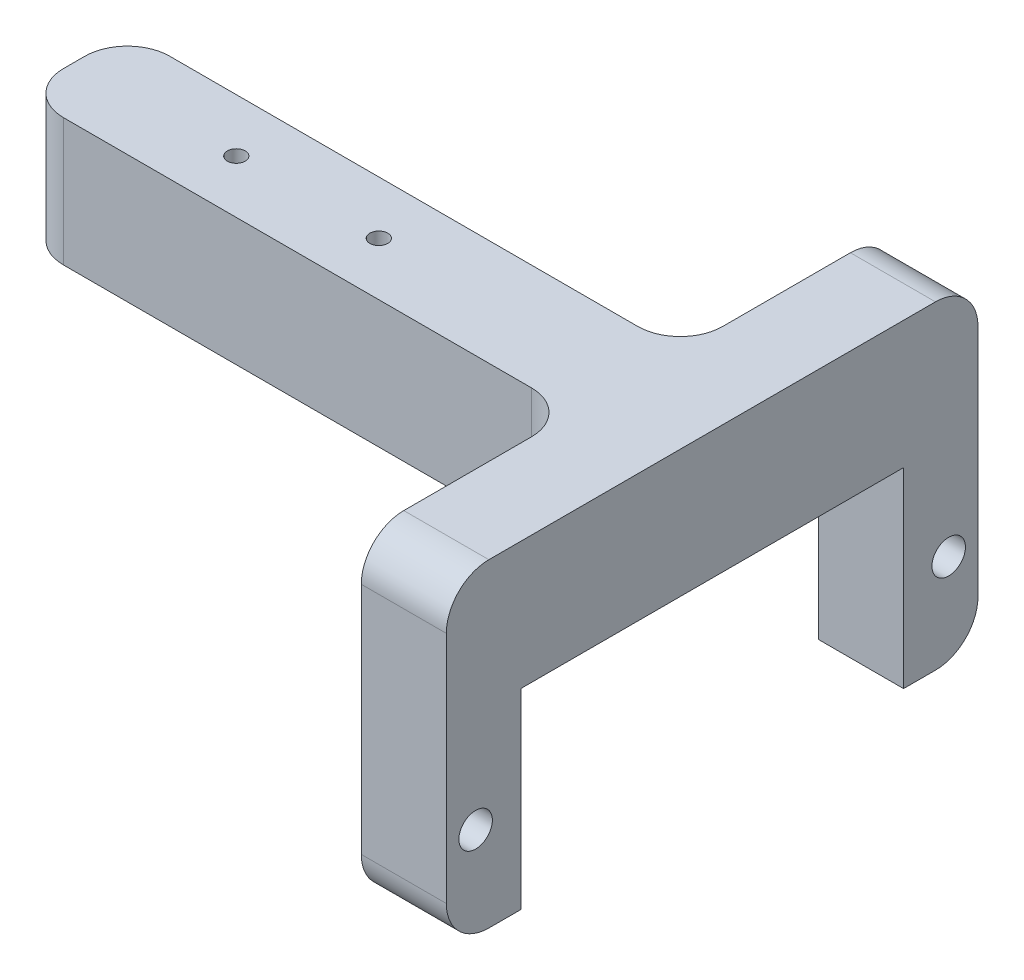
ISO-10303-21;
HEADER;
FILE_DESCRIPTION(('STEP AP214'),'2;1');
FILE_NAME('part.step','',(''),(''),'','','');
FILE_SCHEMA(('AUTOMOTIVE_DESIGN { 1 0 10303 214 1 1 1 1 }'));
ENDSEC;
DATA;
#1=APPLICATION_CONTEXT('core data for automotive mechanical design processes');
#2=APPLICATION_PROTOCOL_DEFINITION('international standard','automotive_design',2000,#1);
#3=PRODUCT_CONTEXT('',#1,'mechanical');
#4=PRODUCT('Part','Part','',(#3));
#5=PRODUCT_RELATED_PRODUCT_CATEGORY('part','',(#4));
#6=PRODUCT_DEFINITION_FORMATION('','',#4);
#7=PRODUCT_DEFINITION_CONTEXT('part definition',#1,'design');
#8=PRODUCT_DEFINITION('design','',#6,#7);
#9=PRODUCT_DEFINITION_SHAPE('','',#8);
#10=(LENGTH_UNIT() NAMED_UNIT(*) SI_UNIT(.MILLI.,.METRE.));
#11=(NAMED_UNIT(*) PLANE_ANGLE_UNIT() SI_UNIT($,.RADIAN.));
#12=(NAMED_UNIT(*) SI_UNIT($,.STERADIAN.) SOLID_ANGLE_UNIT());
#13=UNCERTAINTY_MEASURE_WITH_UNIT(LENGTH_MEASURE(1.E-05),#10,'distance_accuracy_value','');
#14=(GEOMETRIC_REPRESENTATION_CONTEXT(3) GLOBAL_UNCERTAINTY_ASSIGNED_CONTEXT((#13)) GLOBAL_UNIT_ASSIGNED_CONTEXT((#10,
#11,#12)) REPRESENTATION_CONTEXT('',''));
#15=CARTESIAN_POINT('',(0.,0.,0.));
#16=DIRECTION('',(0.,0.,1.));
#17=DIRECTION('',(1.,0.,0.));
#18=AXIS2_PLACEMENT_3D('',#15,#16,#17);
#19=CARTESIAN_POINT('',(0.,0.,0.));
#20=DIRECTION('',(0.,-1.,0.));
#21=DIRECTION('',(0.,0.,-1.));
#22=AXIS2_PLACEMENT_3D('',#19,#20,#21);
#23=PLANE('',#22);
#24=CARTESIAN_POINT('',(-0.857250000000063,0.,0.));
#25=DIRECTION('',(0.,-1.,0.));
#26=DIRECTION('',(0.,0.,-1.));
#27=AXIS2_PLACEMENT_3D('',#24,#25,#26);
#28=CIRCLE('',#27,0.533400000000042);
#29=CARTESIAN_POINT('',(-0.857250000000063,0.,-0.533399999999976));
#30=VERTEX_POINT('',#29);
#31=EDGE_CURVE('E712',#30,#30,#28,.T.);
#32=ORIENTED_EDGE('',*,*,#31,.F.);
#33=EDGE_LOOP('',(#32));
#34=FACE_BOUND('',#33,.T.);
#35=CARTESIAN_POINT('',(-9.36625000000006,0.,0.));
#36=DIRECTION('',(0.,-1.,0.));
#37=DIRECTION('',(0.,0.,-1.));
#38=AXIS2_PLACEMENT_3D('',#35,#36,#37);
#39=CIRCLE('',#38,0.533400000000042);
#40=CARTESIAN_POINT('',(-9.36625000000006,0.,-0.53340000000001));
#41=VERTEX_POINT('',#40);
#42=EDGE_CURVE('E706',#41,#41,#39,.T.);
#43=ORIENTED_EDGE('',*,*,#42,.F.);
#44=EDGE_LOOP('',(#43));
#45=FACE_BOUND('',#44,.T.);
#46=DIRECTION('',(1.,0.,0.));
#47=VECTOR('',#46,1.);
#48=CARTESIAN_POINT('',(-19.05,0.,3.175));
#49=LINE('',#48,#47);
#50=CARTESIAN_POINT('',(-16.51,0.,3.175));
#51=VERTEX_POINT('',#50);
#52=CARTESIAN_POINT('',(11.43,0.,3.175));
#53=VERTEX_POINT('',#52);
#54=EDGE_CURVE('E246',#51,#53,#49,.T.);
#55=ORIENTED_EDGE('',*,*,#54,.F.);
#56=CARTESIAN_POINT('',(-16.51,0.,0.635));
#57=DIRECTION('',(0.,-1.,0.));
#58=DIRECTION('',(0.,0.,-1.));
#59=AXIS2_PLACEMENT_3D('',#56,#57,#58);
#60=CIRCLE('',#59,2.54);
#61=CARTESIAN_POINT('',(-19.05,0.,0.635));
#62=VERTEX_POINT('',#61);
#63=EDGE_CURVE('E50',#51,#62,#60,.T.);
#64=ORIENTED_EDGE('',*,*,#63,.T.);
#65=DIRECTION('',(0.,0.,1.));
#66=VECTOR('',#65,1.);
#67=CARTESIAN_POINT('',(-19.05,0.,3.175));
#68=LINE('',#67,#66);
#69=CARTESIAN_POINT('',(-19.05,0.,-0.635));
#70=VERTEX_POINT('',#69);
#71=EDGE_CURVE('E260',#70,#62,#68,.T.);
#72=ORIENTED_EDGE('',*,*,#71,.F.);
#73=CARTESIAN_POINT('',(-16.51,0.,-0.635));
#74=DIRECTION('',(0.,-1.,0.));
#75=DIRECTION('',(0.,0.,-1.));
#76=AXIS2_PLACEMENT_3D('',#73,#74,#75);
#77=CIRCLE('',#76,2.54);
#78=CARTESIAN_POINT('',(-16.51,0.,-3.175));
#79=VERTEX_POINT('',#78);
#80=EDGE_CURVE('E58',#70,#79,#77,.T.);
#81=ORIENTED_EDGE('',*,*,#80,.T.);
#82=DIRECTION('',(-1.,0.,0.));
#83=VECTOR('',#82,1.);
#84=CARTESIAN_POINT('',(-19.05,0.,-3.175));
#85=LINE('',#84,#83);
#86=CARTESIAN_POINT('',(11.43,0.,-3.175));
#87=VERTEX_POINT('',#86);
#88=EDGE_CURVE('E257',#87,#79,#85,.T.);
#89=ORIENTED_EDGE('',*,*,#88,.F.);
#90=CARTESIAN_POINT('',(11.43,0.,-5.715));
#91=DIRECTION('',(0.,-1.,0.));
#92=DIRECTION('',(0.,0.,-1.));
#93=AXIS2_PLACEMENT_3D('',#90,#91,#92);
#94=CIRCLE('',#93,2.54);
#95=CARTESIAN_POINT('',(13.97,0.,-5.715));
#96=VERTEX_POINT('',#95);
#97=EDGE_CURVE('E11',#87,#96,#94,.F.);
#98=ORIENTED_EDGE('',*,*,#97,.T.);
#99=DIRECTION('',(0.,0.,1.));
#100=VECTOR('',#99,1.);
#101=CARTESIAN_POINT('',(13.97,0.,-15.875));
#102=LINE('',#101,#100);
#103=CARTESIAN_POINT('',(13.97,0.,-11.43));
#104=VERTEX_POINT('',#103);
#105=EDGE_CURVE('E239',#104,#96,#102,.T.);
#106=ORIENTED_EDGE('',*,*,#105,.F.);
#107=DIRECTION('',(-1.,0.,0.));
#108=VECTOR('',#107,1.);
#109=CARTESIAN_POINT('',(0.,0.,-11.43));
#110=LINE('',#109,#108);
#111=CARTESIAN_POINT('',(19.05,0.,-11.43));
#112=VERTEX_POINT('',#111);
#113=EDGE_CURVE('E183',#112,#104,#110,.T.);
#114=ORIENTED_EDGE('',*,*,#113,.F.);
#115=DIRECTION('',(0.,0.,-1.));
#116=VECTOR('',#115,1.);
#117=CARTESIAN_POINT('',(19.05,0.,3.175));
#118=LINE('',#117,#116);
#119=CARTESIAN_POINT('',(19.05,0.,11.43));
#120=VERTEX_POINT('',#119);
#121=EDGE_CURVE('E198',#120,#112,#118,.T.);
#122=ORIENTED_EDGE('',*,*,#121,.F.);
#123=DIRECTION('',(-1.,0.,0.));
#124=VECTOR('',#123,1.);
#125=CARTESIAN_POINT('',(0.,0.,11.43));
#126=LINE('',#125,#124);
#127=CARTESIAN_POINT('',(13.97,0.,11.43));
#128=VERTEX_POINT('',#127);
#129=EDGE_CURVE('E199',#120,#128,#126,.T.);
#130=ORIENTED_EDGE('',*,*,#129,.T.);
#131=DIRECTION('',(0.,0.,-1.));
#132=VECTOR('',#131,1.);
#133=CARTESIAN_POINT('',(13.97,0.,15.875));
#134=LINE('',#133,#132);
#135=CARTESIAN_POINT('',(13.97,0.,5.715));
#136=VERTEX_POINT('',#135);
#137=EDGE_CURVE('E224',#128,#136,#134,.T.);
#138=ORIENTED_EDGE('',*,*,#137,.T.);
#139=CARTESIAN_POINT('',(11.43,0.,5.715));
#140=DIRECTION('',(0.,-1.,0.));
#141=DIRECTION('',(0.,0.,-1.));
#142=AXIS2_PLACEMENT_3D('',#139,#140,#141);
#143=CIRCLE('',#142,2.54);
#144=EDGE_CURVE('E331',#136,#53,#143,.F.);
#145=ORIENTED_EDGE('',*,*,#144,.T.);
#146=EDGE_LOOP('',(#55,#64,#72,#81,#89,#98,#106,#114,#122,#130,#138,#145));
#147=FACE_BOUND('',#146,.T.);
#148=ADVANCED_FACE('F35',(#34,#45,#147),#23,.T.);
#149=CARTESIAN_POINT('',(-19.05,7.62,-3.175));
#150=DIRECTION('',(0.,0.,1.));
#151=DIRECTION('',(1.,0.,0.));
#152=AXIS2_PLACEMENT_3D('',#149,#150,#151);
#153=PLANE('',#152);
#154=DIRECTION('',(-1.,0.,0.));
#155=VECTOR('',#154,1.);
#156=CARTESIAN_POINT('',(-19.05,7.62,-3.175));
#157=LINE('',#156,#155);
#158=CARTESIAN_POINT('',(11.43,7.62,-3.175));
#159=VERTEX_POINT('',#158);
#160=CARTESIAN_POINT('',(-16.51,7.62,-3.175));
#161=VERTEX_POINT('',#160);
#162=EDGE_CURVE('E245',#159,#161,#157,.T.);
#163=ORIENTED_EDGE('',*,*,#162,.F.);
#164=DIRECTION('',(0.,1.,0.));
#165=VECTOR('',#164,1.);
#166=CARTESIAN_POINT('',(11.43,0.,-3.175));
#167=LINE('',#166,#165);
#168=EDGE_CURVE('E321',#159,#87,#167,.F.);
#169=ORIENTED_EDGE('',*,*,#168,.T.);
#170=ORIENTED_EDGE('',*,*,#88,.T.);
#171=DIRECTION('',(0.,-1.,0.));
#172=VECTOR('',#171,1.);
#173=CARTESIAN_POINT('',(-16.51,7.62,-3.175));
#174=LINE('',#173,#172);
#175=EDGE_CURVE('E319',#79,#161,#174,.F.);
#176=ORIENTED_EDGE('',*,*,#175,.T.);
#177=EDGE_LOOP('',(#163,#169,#170,#176));
#178=FACE_BOUND('',#177,.T.);
#179=ADVANCED_FACE('F342',(#178),#153,.F.);
#180=CARTESIAN_POINT('',(19.05,7.62,3.175));
#181=DIRECTION('',(-1.,0.,0.));
#182=DIRECTION('',(0.,0.,1.));
#183=AXIS2_PLACEMENT_3D('',#180,#181,#182);
#184=PLANE('',#183);
#185=CARTESIAN_POINT('',(19.05,-5.95,14.125));
#186=DIRECTION('',(1.,0.,0.));
#187=DIRECTION('',(0.,0.,-1.));
#188=AXIS2_PLACEMENT_3D('',#185,#186,#187);
#189=CIRCLE('',#188,1.);
#190=CARTESIAN_POINT('',(19.05,-5.95,13.125));
#191=VERTEX_POINT('',#190);
#192=EDGE_CURVE('E268',#191,#191,#189,.T.);
#193=ORIENTED_EDGE('',*,*,#192,.F.);
#194=EDGE_LOOP('',(#193));
#195=FACE_BOUND('',#194,.T.);
#196=CARTESIAN_POINT('',(19.05,-5.95,-14.125));
#197=DIRECTION('',(1.,0.,0.));
#198=DIRECTION('',(0.,0.,-1.));
#199=AXIS2_PLACEMENT_3D('',#196,#197,#198);
#200=CIRCLE('',#199,1.);
#201=CARTESIAN_POINT('',(19.05,-5.95,-15.125));
#202=VERTEX_POINT('',#201);
#203=EDGE_CURVE('E700',#202,#202,#200,.T.);
#204=ORIENTED_EDGE('',*,*,#203,.F.);
#205=EDGE_LOOP('',(#204));
#206=FACE_BOUND('',#205,.T.);
#207=DIRECTION('',(0.,0.,-1.));
#208=VECTOR('',#207,1.);
#209=CARTESIAN_POINT('',(19.05,7.62,3.175));
#210=LINE('',#209,#208);
#211=CARTESIAN_POINT('',(19.05,7.62,13.335));
#212=VERTEX_POINT('',#211);
#213=CARTESIAN_POINT('',(19.05,7.62,-13.335));
#214=VERTEX_POINT('',#213);
#215=EDGE_CURVE('E242',#212,#214,#210,.T.);
#216=ORIENTED_EDGE('',*,*,#215,.F.);
#217=CARTESIAN_POINT('',(19.05,5.08,13.335));
#218=DIRECTION('',(-1.,0.,0.));
#219=DIRECTION('',(0.,0.,1.));
#220=AXIS2_PLACEMENT_3D('',#217,#218,#219);
#221=CIRCLE('',#220,2.54);
#222=CARTESIAN_POINT('',(19.05,5.08,15.875));
#223=VERTEX_POINT('',#222);
#224=EDGE_CURVE('E285',#212,#223,#221,.F.);
#225=ORIENTED_EDGE('',*,*,#224,.T.);
#226=DIRECTION('',(0.,-1.,0.));
#227=VECTOR('',#226,1.);
#228=CARTESIAN_POINT('',(19.05,7.62,15.875));
#229=LINE('',#228,#227);
#230=CARTESIAN_POINT('',(19.05,-8.88999999999999,15.875));
#231=VERTEX_POINT('',#230);
#232=EDGE_CURVE('E218',#223,#231,#229,.T.);
#233=ORIENTED_EDGE('',*,*,#232,.T.);
#234=CARTESIAN_POINT('',(19.05,-8.89,13.335));
#235=DIRECTION('',(-1.,0.,0.));
#236=DIRECTION('',(0.,0.,1.));
#237=AXIS2_PLACEMENT_3D('',#234,#235,#236);
#238=CIRCLE('',#237,2.54);
#239=CARTESIAN_POINT('',(19.05,-11.43,13.335));
#240=VERTEX_POINT('',#239);
#241=EDGE_CURVE('E279',#231,#240,#238,.F.);
#242=ORIENTED_EDGE('',*,*,#241,.T.);
#243=DIRECTION('',(0.,0.,1.));
#244=VECTOR('',#243,1.);
#245=CARTESIAN_POINT('',(19.05,-11.43,0.));
#246=LINE('',#245,#244);
#247=CARTESIAN_POINT('',(19.05,-11.43,11.43));
#248=VERTEX_POINT('',#247);
#249=EDGE_CURVE('E209',#248,#240,#246,.T.);
#250=ORIENTED_EDGE('',*,*,#249,.F.);
#251=DIRECTION('',(0.,1.,0.));
#252=VECTOR('',#251,1.);
#253=CARTESIAN_POINT('',(19.05,-11.43,11.43));
#254=LINE('',#253,#252);
#255=EDGE_CURVE('E216',#248,#120,#254,.T.);
#256=ORIENTED_EDGE('',*,*,#255,.T.);
#257=ORIENTED_EDGE('',*,*,#121,.T.);
#258=DIRECTION('',(0.,1.,0.));
#259=VECTOR('',#258,1.);
#260=CARTESIAN_POINT('',(19.05,-11.43,-11.43));
#261=LINE('',#260,#259);
#262=CARTESIAN_POINT('',(19.05,-11.43,-11.43));
#263=VERTEX_POINT('',#262);
#264=EDGE_CURVE('E187',#263,#112,#261,.T.);
#265=ORIENTED_EDGE('',*,*,#264,.F.);
#266=DIRECTION('',(0.,0.,1.));
#267=VECTOR('',#266,1.);
#268=CARTESIAN_POINT('',(19.05,-11.43,0.));
#269=LINE('',#268,#267);
#270=CARTESIAN_POINT('',(19.05,-11.43,-13.335));
#271=VERTEX_POINT('',#270);
#272=EDGE_CURVE('E173',#271,#263,#269,.T.);
#273=ORIENTED_EDGE('',*,*,#272,.F.);
#274=CARTESIAN_POINT('',(19.05,-8.89,-13.335));
#275=DIRECTION('',(-1.,0.,0.));
#276=DIRECTION('',(0.,0.,1.));
#277=AXIS2_PLACEMENT_3D('',#274,#275,#276);
#278=CIRCLE('',#277,2.54);
#279=CARTESIAN_POINT('',(19.05,-8.88999999999999,-15.875));
#280=VERTEX_POINT('',#279);
#281=EDGE_CURVE('E281',#271,#280,#278,.F.);
#282=ORIENTED_EDGE('',*,*,#281,.T.);
#283=DIRECTION('',(0.,-1.,0.));
#284=VECTOR('',#283,1.);
#285=CARTESIAN_POINT('',(19.05,7.62,-15.875));
#286=LINE('',#285,#284);
#287=CARTESIAN_POINT('',(19.05,5.08,-15.875));
#288=VERTEX_POINT('',#287);
#289=EDGE_CURVE('E230',#288,#280,#286,.T.);
#290=ORIENTED_EDGE('',*,*,#289,.F.);
#291=CARTESIAN_POINT('',(19.05,5.08,-13.335));
#292=DIRECTION('',(-1.,0.,0.));
#293=DIRECTION('',(0.,0.,1.));
#294=AXIS2_PLACEMENT_3D('',#291,#292,#293);
#295=CIRCLE('',#294,2.54);
#296=EDGE_CURVE('E283',#288,#214,#295,.F.);
#297=ORIENTED_EDGE('',*,*,#296,.T.);
#298=EDGE_LOOP('',(#216,#225,#233,#242,#250,#256,#257,#265,#273,#282,#290,#297));
#299=FACE_BOUND('',#298,.T.);
#300=ADVANCED_FACE('F196',(#195,#206,#299),#184,.F.);
#301=CARTESIAN_POINT('',(-19.05,7.62,3.175));
#302=DIRECTION('',(1.,0.,0.));
#303=DIRECTION('',(0.,0.,-1.));
#304=AXIS2_PLACEMENT_3D('',#301,#302,#303);
#305=PLANE('',#304);
#306=ORIENTED_EDGE('',*,*,#71,.T.);
#307=DIRECTION('',(0.,-1.,0.));
#308=VECTOR('',#307,1.);
#309=CARTESIAN_POINT('',(-19.05,7.62,0.635));
#310=LINE('',#309,#308);
#311=CARTESIAN_POINT('',(-19.05,7.62,0.635));
#312=VERTEX_POINT('',#311);
#313=EDGE_CURVE('E327',#62,#312,#310,.F.);
#314=ORIENTED_EDGE('',*,*,#313,.T.);
#315=DIRECTION('',(0.,0.,1.));
#316=VECTOR('',#315,1.);
#317=CARTESIAN_POINT('',(-19.05,7.62,3.175));
#318=LINE('',#317,#316);
#319=CARTESIAN_POINT('',(-19.05,7.62,-0.635));
#320=VERTEX_POINT('',#319);
#321=EDGE_CURVE('E249',#320,#312,#318,.T.);
#322=ORIENTED_EDGE('',*,*,#321,.F.);
#323=DIRECTION('',(0.,-1.,0.));
#324=VECTOR('',#323,1.);
#325=CARTESIAN_POINT('',(-19.05,7.62,-0.635));
#326=LINE('',#325,#324);
#327=EDGE_CURVE('E325',#320,#70,#326,.T.);
#328=ORIENTED_EDGE('',*,*,#327,.T.);
#329=EDGE_LOOP('',(#306,#314,#322,#328));
#330=FACE_BOUND('',#329,.T.);
#331=ADVANCED_FACE('F374',(#330),#305,.F.);
#332=CARTESIAN_POINT('',(-19.05,7.62,3.175));
#333=DIRECTION('',(0.,0.,-1.));
#334=DIRECTION('',(-1.,0.,0.));
#335=AXIS2_PLACEMENT_3D('',#332,#333,#334);
#336=PLANE('',#335);
#337=ORIENTED_EDGE('',*,*,#54,.T.);
#338=DIRECTION('',(0.,1.,0.));
#339=VECTOR('',#338,1.);
#340=CARTESIAN_POINT('',(11.43,7.62,3.175));
#341=LINE('',#340,#339);
#342=CARTESIAN_POINT('',(11.43,7.62,3.175));
#343=VERTEX_POINT('',#342);
#344=EDGE_CURVE('E316',#53,#343,#341,.T.);
#345=ORIENTED_EDGE('',*,*,#344,.T.);
#346=DIRECTION('',(1.,0.,0.));
#347=VECTOR('',#346,1.);
#348=CARTESIAN_POINT('',(-19.05,7.62,3.175));
#349=LINE('',#348,#347);
#350=CARTESIAN_POINT('',(-16.51,7.62,3.175));
#351=VERTEX_POINT('',#350);
#352=EDGE_CURVE('E252',#351,#343,#349,.T.);
#353=ORIENTED_EDGE('',*,*,#352,.F.);
#354=DIRECTION('',(0.,-1.,0.));
#355=VECTOR('',#354,1.);
#356=CARTESIAN_POINT('',(-16.51,7.62,3.175));
#357=LINE('',#356,#355);
#358=EDGE_CURVE('E313',#351,#51,#357,.T.);
#359=ORIENTED_EDGE('',*,*,#358,.T.);
#360=EDGE_LOOP('',(#337,#345,#353,#359));
#361=FACE_BOUND('',#360,.T.);
#362=ADVANCED_FACE('F365',(#361),#336,.F.);
#363=CARTESIAN_POINT('',(0.,7.62,0.));
#364=DIRECTION('',(0.,-1.,0.));
#365=DIRECTION('',(0.,0.,-1.));
#366=AXIS2_PLACEMENT_3D('',#363,#364,#365);
#367=PLANE('',#366);
#368=CARTESIAN_POINT('',(-0.857250000000063,7.62,0.));
#369=DIRECTION('',(0.,-1.,0.));
#370=DIRECTION('',(0.,0.,-1.));
#371=AXIS2_PLACEMENT_3D('',#368,#369,#370);
#372=CIRCLE('',#371,0.533400000000042);
#373=CARTESIAN_POINT('',(-0.857250000000063,7.62,-0.533399999999976));
#374=VERTEX_POINT('',#373);
#375=EDGE_CURVE('E703',#374,#374,#372,.T.);
#376=ORIENTED_EDGE('',*,*,#375,.T.);
#377=EDGE_LOOP('',(#376));
#378=FACE_BOUND('',#377,.T.);
#379=CARTESIAN_POINT('',(-9.36625000000006,7.62,0.));
#380=DIRECTION('',(0.,-1.,0.));
#381=DIRECTION('',(0.,0.,-1.));
#382=AXIS2_PLACEMENT_3D('',#379,#380,#381);
#383=CIRCLE('',#382,0.533400000000042);
#384=CARTESIAN_POINT('',(-9.36625000000006,7.62,-0.53340000000001));
#385=VERTEX_POINT('',#384);
#386=EDGE_CURVE('E709',#385,#385,#383,.T.);
#387=ORIENTED_EDGE('',*,*,#386,.T.);
#388=EDGE_LOOP('',(#387));
#389=FACE_BOUND('',#388,.T.);
#390=DIRECTION('',(0.,0.,-1.));
#391=VECTOR('',#390,1.);
#392=CARTESIAN_POINT('',(13.97,7.62,15.875));
#393=LINE('',#392,#391);
#394=CARTESIAN_POINT('',(13.97,7.62,13.335));
#395=VERTEX_POINT('',#394);
#396=CARTESIAN_POINT('',(13.97,7.62,5.715));
#397=VERTEX_POINT('',#396);
#398=EDGE_CURVE('E227',#395,#397,#393,.T.);
#399=ORIENTED_EDGE('',*,*,#398,.F.);
#400=DIRECTION('',(1.,0.,0.));
#401=VECTOR('',#400,1.);
#402=CARTESIAN_POINT('',(19.05,7.62,13.335));
#403=LINE('',#402,#401);
#404=EDGE_CURVE('E276',#395,#212,#403,.T.);
#405=ORIENTED_EDGE('',*,*,#404,.T.);
#406=ORIENTED_EDGE('',*,*,#215,.T.);
#407=DIRECTION('',(1.,0.,0.));
#408=VECTOR('',#407,1.);
#409=CARTESIAN_POINT('',(13.97,7.62,-13.335));
#410=LINE('',#409,#408);
#411=CARTESIAN_POINT('',(13.97,7.62,-13.335));
#412=VERTEX_POINT('',#411);
#413=EDGE_CURVE('E274',#214,#412,#410,.F.);
#414=ORIENTED_EDGE('',*,*,#413,.T.);
#415=DIRECTION('',(0.,0.,1.));
#416=VECTOR('',#415,1.);
#417=CARTESIAN_POINT('',(13.97,7.62,-15.875));
#418=LINE('',#417,#416);
#419=CARTESIAN_POINT('',(13.97,7.62,-5.715));
#420=VERTEX_POINT('',#419);
#421=EDGE_CURVE('E236',#412,#420,#418,.T.);
#422=ORIENTED_EDGE('',*,*,#421,.T.);
#423=CARTESIAN_POINT('',(11.43,7.62,-5.715));
#424=DIRECTION('',(0.,-1.,0.));
#425=DIRECTION('',(0.,0.,-1.));
#426=AXIS2_PLACEMENT_3D('',#423,#424,#425);
#427=CIRCLE('',#426,2.54);
#428=EDGE_CURVE('E43',#420,#159,#427,.T.);
#429=ORIENTED_EDGE('',*,*,#428,.T.);
#430=ORIENTED_EDGE('',*,*,#162,.T.);
#431=CARTESIAN_POINT('',(-16.51,7.62,-0.635));
#432=DIRECTION('',(0.,-1.,0.));
#433=DIRECTION('',(0.,0.,-1.));
#434=AXIS2_PLACEMENT_3D('',#431,#432,#433);
#435=CIRCLE('',#434,2.54);
#436=EDGE_CURVE('E255',#161,#320,#435,.F.);
#437=ORIENTED_EDGE('',*,*,#436,.T.);
#438=ORIENTED_EDGE('',*,*,#321,.T.);
#439=CARTESIAN_POINT('',(-16.51,7.62,0.635));
#440=DIRECTION('',(0.,-1.,0.));
#441=DIRECTION('',(0.,0.,-1.));
#442=AXIS2_PLACEMENT_3D('',#439,#440,#441);
#443=CIRCLE('',#442,2.54);
#444=EDGE_CURVE('E272',#312,#351,#443,.F.);
#445=ORIENTED_EDGE('',*,*,#444,.T.);
#446=ORIENTED_EDGE('',*,*,#352,.T.);
#447=CARTESIAN_POINT('',(11.43,7.62,5.715));
#448=DIRECTION('',(0.,-1.,0.));
#449=DIRECTION('',(0.,0.,-1.));
#450=AXIS2_PLACEMENT_3D('',#447,#448,#449);
#451=CIRCLE('',#450,2.54);
#452=EDGE_CURVE('E329',#343,#397,#451,.T.);
#453=ORIENTED_EDGE('',*,*,#452,.T.);
#454=EDGE_LOOP('',(#399,#405,#406,#414,#422,#429,#430,#437,#438,#445,#446,#453));
#455=FACE_BOUND('',#454,.T.);
#456=ADVANCED_FACE('F335',(#378,#389,#455),#367,.F.);
#457=CARTESIAN_POINT('',(13.97,7.62,-15.875));
#458=DIRECTION('',(1.,0.,0.));
#459=DIRECTION('',(0.,0.,-1.));
#460=AXIS2_PLACEMENT_3D('',#457,#458,#459);
#461=PLANE('',#460);
#462=CARTESIAN_POINT('',(13.97,-5.95,-14.125));
#463=DIRECTION('',(1.,0.,0.));
#464=DIRECTION('',(0.,0.,-1.));
#465=AXIS2_PLACEMENT_3D('',#462,#463,#464);
#466=CIRCLE('',#465,1.);
#467=CARTESIAN_POINT('',(13.97,-5.95,-15.125));
#468=VERTEX_POINT('',#467);
#469=EDGE_CURVE('E267',#468,#468,#466,.T.);
#470=ORIENTED_EDGE('',*,*,#469,.T.);
#471=EDGE_LOOP('',(#470));
#472=FACE_BOUND('',#471,.T.);
#473=ORIENTED_EDGE('',*,*,#421,.F.);
#474=CARTESIAN_POINT('',(13.97,5.08,-13.335));
#475=DIRECTION('',(1.,0.,0.));
#476=DIRECTION('',(0.,0.,-1.));
#477=AXIS2_PLACEMENT_3D('',#474,#475,#476);
#478=CIRCLE('',#477,2.54);
#479=CARTESIAN_POINT('',(13.97,5.08,-15.875));
#480=VERTEX_POINT('',#479);
#481=EDGE_CURVE('E307',#412,#480,#478,.F.);
#482=ORIENTED_EDGE('',*,*,#481,.T.);
#483=DIRECTION('',(0.,1.,0.));
#484=VECTOR('',#483,1.);
#485=CARTESIAN_POINT('',(13.97,7.62,-15.875));
#486=LINE('',#485,#484);
#487=CARTESIAN_POINT('',(13.97,-8.88999999999999,-15.875));
#488=VERTEX_POINT('',#487);
#489=EDGE_CURVE('E233',#488,#480,#486,.T.);
#490=ORIENTED_EDGE('',*,*,#489,.F.);
#491=CARTESIAN_POINT('',(13.97,-8.89,-13.335));
#492=DIRECTION('',(1.,0.,0.));
#493=DIRECTION('',(0.,0.,-1.));
#494=AXIS2_PLACEMENT_3D('',#491,#492,#493);
#495=CIRCLE('',#494,2.54);
#496=CARTESIAN_POINT('',(13.97,-11.43,-13.335));
#497=VERTEX_POINT('',#496);
#498=EDGE_CURVE('E305',#488,#497,#495,.F.);
#499=ORIENTED_EDGE('',*,*,#498,.T.);
#500=DIRECTION('',(0.,0.,-1.));
#501=VECTOR('',#500,1.);
#502=CARTESIAN_POINT('',(13.97,-11.43,0.));
#503=LINE('',#502,#501);
#504=CARTESIAN_POINT('',(13.97,-11.43,-11.43));
#505=VERTEX_POINT('',#504);
#506=EDGE_CURVE('E192',#505,#497,#503,.T.);
#507=ORIENTED_EDGE('',*,*,#506,.F.);
#508=DIRECTION('',(0.,1.,0.));
#509=VECTOR('',#508,1.);
#510=CARTESIAN_POINT('',(13.97,-11.43,-11.43));
#511=LINE('',#510,#509);
#512=EDGE_CURVE('E190',#505,#104,#511,.T.);
#513=ORIENTED_EDGE('',*,*,#512,.T.);
#514=ORIENTED_EDGE('',*,*,#105,.T.);
#515=DIRECTION('',(0.,1.,0.));
#516=VECTOR('',#515,1.);
#517=CARTESIAN_POINT('',(13.97,7.62,-5.715));
#518=LINE('',#517,#516);
#519=EDGE_CURVE('E302',#96,#420,#518,.T.);
#520=ORIENTED_EDGE('',*,*,#519,.T.);
#521=EDGE_LOOP('',(#473,#482,#490,#499,#507,#513,#514,#520));
#522=FACE_BOUND('',#521,.T.);
#523=ADVANCED_FACE('F348',(#472,#522),#461,.F.);
#524=CARTESIAN_POINT('',(0.,0.,-15.875));
#525=DIRECTION('',(0.,0.,-1.));
#526=DIRECTION('',(-1.,0.,0.));
#527=AXIS2_PLACEMENT_3D('',#524,#525,#526);
#528=PLANE('',#527);
#529=ORIENTED_EDGE('',*,*,#489,.T.);
#530=DIRECTION('',(1.,0.,0.));
#531=VECTOR('',#530,1.);
#532=CARTESIAN_POINT('',(19.05,5.08,-15.875));
#533=LINE('',#532,#531);
#534=EDGE_CURVE('E299',#480,#288,#533,.T.);
#535=ORIENTED_EDGE('',*,*,#534,.T.);
#536=ORIENTED_EDGE('',*,*,#289,.T.);
#537=DIRECTION('',(1.,0.,0.));
#538=VECTOR('',#537,1.);
#539=CARTESIAN_POINT('',(0.,-8.89,-15.875));
#540=LINE('',#539,#538);
#541=EDGE_CURVE('E297',#280,#488,#540,.F.);
#542=ORIENTED_EDGE('',*,*,#541,.T.);
#543=EDGE_LOOP('',(#529,#535,#536,#542));
#544=FACE_BOUND('',#543,.T.);
#545=ADVANCED_FACE('F499',(#544),#528,.T.);
#546=CARTESIAN_POINT('',(13.97,7.62,15.875));
#547=DIRECTION('',(-1.,0.,0.));
#548=DIRECTION('',(0.,0.,1.));
#549=AXIS2_PLACEMENT_3D('',#546,#547,#548);
#550=PLANE('',#549);
#551=CARTESIAN_POINT('',(13.97,-5.95,14.125));
#552=DIRECTION('',(-1.,0.,0.));
#553=DIRECTION('',(0.,0.,1.));
#554=AXIS2_PLACEMENT_3D('',#551,#552,#553);
#555=CIRCLE('',#554,1.);
#556=CARTESIAN_POINT('',(13.97,-5.95,13.125));
#557=VERTEX_POINT('',#556);
#558=EDGE_CURVE('E264',#557,#557,#555,.T.);
#559=ORIENTED_EDGE('',*,*,#558,.F.);
#560=EDGE_LOOP('',(#559));
#561=FACE_BOUND('',#560,.T.);
#562=DIRECTION('',(0.,1.,0.));
#563=VECTOR('',#562,1.);
#564=CARTESIAN_POINT('',(13.97,7.62,15.875));
#565=LINE('',#564,#563);
#566=CARTESIAN_POINT('',(13.97,-8.88999999999999,15.875));
#567=VERTEX_POINT('',#566);
#568=CARTESIAN_POINT('',(13.97,5.08,15.875));
#569=VERTEX_POINT('',#568);
#570=EDGE_CURVE('E221',#567,#569,#565,.T.);
#571=ORIENTED_EDGE('',*,*,#570,.T.);
#572=CARTESIAN_POINT('',(13.97,5.08,13.335));
#573=DIRECTION('',(-1.,0.,0.));
#574=DIRECTION('',(0.,0.,1.));
#575=AXIS2_PLACEMENT_3D('',#572,#573,#574);
#576=CIRCLE('',#575,2.54);
#577=EDGE_CURVE('E295',#569,#395,#576,.T.);
#578=ORIENTED_EDGE('',*,*,#577,.T.);
#579=ORIENTED_EDGE('',*,*,#398,.T.);
#580=DIRECTION('',(0.,1.,0.));
#581=VECTOR('',#580,1.);
#582=CARTESIAN_POINT('',(13.97,7.62,5.715));
#583=LINE('',#582,#581);
#584=EDGE_CURVE('E291',#397,#136,#583,.F.);
#585=ORIENTED_EDGE('',*,*,#584,.T.);
#586=ORIENTED_EDGE('',*,*,#137,.F.);
#587=DIRECTION('',(0.,1.,0.));
#588=VECTOR('',#587,1.);
#589=CARTESIAN_POINT('',(13.97,-11.43,11.43));
#590=LINE('',#589,#588);
#591=CARTESIAN_POINT('',(13.97,-11.43,11.43));
#592=VERTEX_POINT('',#591);
#593=EDGE_CURVE('E213',#592,#128,#590,.T.);
#594=ORIENTED_EDGE('',*,*,#593,.F.);
#595=DIRECTION('',(0.,0.,-1.));
#596=VECTOR('',#595,1.);
#597=CARTESIAN_POINT('',(13.97,-11.43,0.));
#598=LINE('',#597,#596);
#599=CARTESIAN_POINT('',(13.97,-11.43,13.335));
#600=VERTEX_POINT('',#599);
#601=EDGE_CURVE('E212',#600,#592,#598,.T.);
#602=ORIENTED_EDGE('',*,*,#601,.F.);
#603=CARTESIAN_POINT('',(13.97,-8.89,13.335));
#604=DIRECTION('',(-1.,0.,0.));
#605=DIRECTION('',(0.,0.,1.));
#606=AXIS2_PLACEMENT_3D('',#603,#604,#605);
#607=CIRCLE('',#606,2.54);
#608=EDGE_CURVE('E293',#600,#567,#607,.T.);
#609=ORIENTED_EDGE('',*,*,#608,.T.);
#610=EDGE_LOOP('',(#571,#578,#579,#585,#586,#594,#602,#609));
#611=FACE_BOUND('',#610,.T.);
#612=ADVANCED_FACE('F358',(#561,#611),#550,.T.);
#613=CARTESIAN_POINT('',(0.,0.,15.875));
#614=DIRECTION('',(0.,0.,1.));
#615=DIRECTION('',(-1.,0.,0.));
#616=AXIS2_PLACEMENT_3D('',#613,#614,#615);
#617=PLANE('',#616);
#618=ORIENTED_EDGE('',*,*,#232,.F.);
#619=DIRECTION('',(1.,0.,0.));
#620=VECTOR('',#619,1.);
#621=CARTESIAN_POINT('',(13.97,5.08,15.875));
#622=LINE('',#621,#620);
#623=EDGE_CURVE('E289',#223,#569,#622,.F.);
#624=ORIENTED_EDGE('',*,*,#623,.T.);
#625=ORIENTED_EDGE('',*,*,#570,.F.);
#626=DIRECTION('',(-1.,0.,0.));
#627=VECTOR('',#626,1.);
#628=CARTESIAN_POINT('',(0.,-8.89,15.875));
#629=LINE('',#628,#627);
#630=EDGE_CURVE('E287',#567,#231,#629,.F.);
#631=ORIENTED_EDGE('',*,*,#630,.T.);
#632=EDGE_LOOP('',(#618,#624,#625,#631));
#633=FACE_BOUND('',#632,.T.);
#634=ADVANCED_FACE('F493',(#633),#617,.T.);
#635=CARTESIAN_POINT('',(0.,-11.43,11.43));
#636=DIRECTION('',(0.,0.,-1.));
#637=DIRECTION('',(-1.,0.,0.));
#638=AXIS2_PLACEMENT_3D('',#635,#636,#637);
#639=PLANE('',#638);
#640=ORIENTED_EDGE('',*,*,#129,.F.);
#641=ORIENTED_EDGE('',*,*,#255,.F.);
#642=DIRECTION('',(-1.,0.,0.));
#643=VECTOR('',#642,1.);
#644=CARTESIAN_POINT('',(0.,-11.43,11.43));
#645=LINE('',#644,#643);
#646=EDGE_CURVE('E202',#248,#592,#645,.T.);
#647=ORIENTED_EDGE('',*,*,#646,.T.);
#648=ORIENTED_EDGE('',*,*,#593,.T.);
#649=EDGE_LOOP('',(#640,#641,#647,#648));
#650=FACE_BOUND('',#649,.T.);
#651=ADVANCED_FACE('F489',(#650),#639,.T.);
#652=CARTESIAN_POINT('',(0.,-11.43,0.));
#653=DIRECTION('',(0.,-1.,0.));
#654=DIRECTION('',(0.,0.,-1.));
#655=AXIS2_PLACEMENT_3D('',#652,#653,#654);
#656=PLANE('',#655);
#657=ORIENTED_EDGE('',*,*,#249,.T.);
#658=DIRECTION('',(-1.,0.,0.));
#659=VECTOR('',#658,1.);
#660=CARTESIAN_POINT('',(0.,-11.43,13.335));
#661=LINE('',#660,#659);
#662=EDGE_CURVE('E310',#240,#600,#661,.T.);
#663=ORIENTED_EDGE('',*,*,#662,.T.);
#664=ORIENTED_EDGE('',*,*,#601,.T.);
#665=ORIENTED_EDGE('',*,*,#646,.F.);
#666=EDGE_LOOP('',(#657,#663,#664,#665));
#667=FACE_BOUND('',#666,.T.);
#668=ADVANCED_FACE('F486',(#667),#656,.T.);
#669=CARTESIAN_POINT('',(0.,-11.43,-11.43));
#670=DIRECTION('',(0.,0.,-1.));
#671=DIRECTION('',(-1.,0.,0.));
#672=AXIS2_PLACEMENT_3D('',#669,#670,#671);
#673=PLANE('',#672);
#674=ORIENTED_EDGE('',*,*,#113,.T.);
#675=ORIENTED_EDGE('',*,*,#512,.F.);
#676=DIRECTION('',(-1.,0.,0.));
#677=VECTOR('',#676,1.);
#678=CARTESIAN_POINT('',(0.,-11.43,-11.43));
#679=LINE('',#678,#677);
#680=EDGE_CURVE('E177',#263,#505,#679,.T.);
#681=ORIENTED_EDGE('',*,*,#680,.F.);
#682=ORIENTED_EDGE('',*,*,#264,.T.);
#683=EDGE_LOOP('',(#674,#675,#681,#682));
#684=FACE_BOUND('',#683,.T.);
#685=ADVANCED_FACE('F186',(#684),#673,.F.);
#686=CARTESIAN_POINT('',(0.,-11.43,0.));
#687=DIRECTION('',(0.,-1.,0.));
#688=DIRECTION('',(0.,0.,-1.));
#689=AXIS2_PLACEMENT_3D('',#686,#687,#688);
#690=PLANE('',#689);
#691=ORIENTED_EDGE('',*,*,#506,.T.);
#692=DIRECTION('',(1.,0.,0.));
#693=VECTOR('',#692,1.);
#694=CARTESIAN_POINT('',(0.,-11.43,-13.335));
#695=LINE('',#694,#693);
#696=EDGE_CURVE('E180',#497,#271,#695,.T.);
#697=ORIENTED_EDGE('',*,*,#696,.T.);
#698=ORIENTED_EDGE('',*,*,#272,.T.);
#699=ORIENTED_EDGE('',*,*,#680,.T.);
#700=EDGE_LOOP('',(#691,#697,#698,#699));
#701=FACE_BOUND('',#700,.T.);
#702=ADVANCED_FACE('F176',(#701),#690,.T.);
#703=CARTESIAN_POINT('',(-19.05,-5.95,14.125));
#704=DIRECTION('',(1.,0.,0.));
#705=DIRECTION('',(0.,0.,-1.));
#706=AXIS2_PLACEMENT_3D('',#703,#704,#705);
#707=CYLINDRICAL_SURFACE('',#706,1.);
#708=CARTESIAN_POINT('',(13.97,-5.95,13.125));
#709=CARTESIAN_POINT('',(14.0229166666667,-5.95,13.125));
#710=CARTESIAN_POINT('',(14.0758333333333,-5.95,13.125));
#711=CARTESIAN_POINT('',(14.1816666666667,-5.95,13.125));
#712=CARTESIAN_POINT('',(14.2345833333333,-5.95,13.125));
#713=CARTESIAN_POINT('',(14.3404166666667,-5.95,13.125));
#714=CARTESIAN_POINT('',(14.3933333333333,-5.95,13.125));
#715=CARTESIAN_POINT('',(14.4991666666667,-5.95,13.125));
#716=CARTESIAN_POINT('',(14.5520833333333,-5.95,13.125));
#717=CARTESIAN_POINT('',(14.6579166666667,-5.95,13.125));
#718=CARTESIAN_POINT('',(14.7108333333333,-5.95,13.125));
#719=CARTESIAN_POINT('',(14.8166666666667,-5.95,13.125));
#720=CARTESIAN_POINT('',(14.8695833333333,-5.95,13.125));
#721=CARTESIAN_POINT('',(14.9754166666667,-5.95,13.125));
#722=CARTESIAN_POINT('',(15.0283333333333,-5.95,13.125));
#723=CARTESIAN_POINT('',(15.1341666666667,-5.95,13.125));
#724=CARTESIAN_POINT('',(15.1870833333333,-5.95,13.125));
#725=CARTESIAN_POINT('',(15.2929166666667,-5.95,13.125));
#726=CARTESIAN_POINT('',(15.3458333333333,-5.95,13.125));
#727=CARTESIAN_POINT('',(15.4516666666667,-5.95,13.125));
#728=CARTESIAN_POINT('',(15.5045833333333,-5.95,13.125));
#729=CARTESIAN_POINT('',(15.6104166666667,-5.95,13.125));
#730=CARTESIAN_POINT('',(15.6633333333333,-5.95,13.125));
#731=CARTESIAN_POINT('',(15.7691666666667,-5.95,13.125));
#732=CARTESIAN_POINT('',(15.8220833333333,-5.95,13.125));
#733=CARTESIAN_POINT('',(15.9279166666667,-5.95,13.125));
#734=CARTESIAN_POINT('',(15.9808333333333,-5.95,13.125));
#735=CARTESIAN_POINT('',(16.0866666666667,-5.95,13.125));
#736=CARTESIAN_POINT('',(16.1395833333333,-5.95,13.125));
#737=CARTESIAN_POINT('',(16.2454166666667,-5.95,13.125));
#738=CARTESIAN_POINT('',(16.2983333333333,-5.95,13.125));
#739=CARTESIAN_POINT('',(16.4041666666667,-5.95,13.125));
#740=CARTESIAN_POINT('',(16.4570833333333,-5.95,13.125));
#741=CARTESIAN_POINT('',(16.5629166666667,-5.95,13.125));
#742=CARTESIAN_POINT('',(16.6158333333333,-5.95,13.125));
#743=CARTESIAN_POINT('',(16.7216666666667,-5.95,13.125));
#744=CARTESIAN_POINT('',(16.7745833333333,-5.95,13.125));
#745=CARTESIAN_POINT('',(16.8804166666667,-5.95,13.125));
#746=CARTESIAN_POINT('',(16.9333333333333,-5.95,13.125));
#747=CARTESIAN_POINT('',(17.0391666666667,-5.95,13.125));
#748=CARTESIAN_POINT('',(17.0920833333333,-5.95,13.125));
#749=CARTESIAN_POINT('',(17.1979166666667,-5.95,13.125));
#750=CARTESIAN_POINT('',(17.2508333333333,-5.95,13.125));
#751=CARTESIAN_POINT('',(17.3566666666667,-5.95,13.125));
#752=CARTESIAN_POINT('',(17.4095833333333,-5.95,13.125));
#753=CARTESIAN_POINT('',(17.5154166666667,-5.95,13.125));
#754=CARTESIAN_POINT('',(17.5683333333333,-5.95,13.125));
#755=CARTESIAN_POINT('',(17.6741666666667,-5.95,13.125));
#756=CARTESIAN_POINT('',(17.7270833333333,-5.95,13.125));
#757=CARTESIAN_POINT('',(17.8329166666667,-5.95,13.125));
#758=CARTESIAN_POINT('',(17.8858333333333,-5.95,13.125));
#759=CARTESIAN_POINT('',(17.9916666666667,-5.95,13.125));
#760=CARTESIAN_POINT('',(18.0445833333333,-5.95,13.125));
#761=CARTESIAN_POINT('',(18.1504166666667,-5.95,13.125));
#762=CARTESIAN_POINT('',(18.2033333333333,-5.95,13.125));
#763=CARTESIAN_POINT('',(18.3091666666667,-5.95,13.125));
#764=CARTESIAN_POINT('',(18.3620833333333,-5.95,13.125));
#765=CARTESIAN_POINT('',(18.4679166666667,-5.95,13.125));
#766=CARTESIAN_POINT('',(18.5208333333333,-5.95,13.125));
#767=CARTESIAN_POINT('',(18.6266666666667,-5.95,13.125));
#768=CARTESIAN_POINT('',(18.6795833333333,-5.95,13.125));
#769=CARTESIAN_POINT('',(18.7854166666667,-5.95,13.125));
#770=CARTESIAN_POINT('',(18.8383333333333,-5.95,13.125));
#771=CARTESIAN_POINT('',(18.9441666666667,-5.95,13.125));
#772=CARTESIAN_POINT('',(18.9970833333333,-5.95,13.125));
#773=CARTESIAN_POINT('',(19.05,-5.95,13.125));
#774=B_SPLINE_CURVE_WITH_KNOTS('',3,(#708,#709,#710,#711,#712,#713,#714,#715,#716,#717,#718,
#719,#720,#721,#722,#723,#724,#725,#726,#727,#728,#729,#730,#731,#732,#733,#734,#735,#736,#737,
#738,#739,#740,#741,#742,#743,#744,#745,#746,#747,#748,#749,#750,#751,#752,#753,#754,#755,#756,
#757,#758,#759,#760,#761,#762,#763,#764,#765,#766,#767,#768,#769,#770,#771,#772,#773),
.UNSPECIFIED.,.F.,.F.,(4,2,2,2,2,2,2,2,2,2,2,2,2,2,2,2,2,2,2,2,2,2,2,2,2,2,2,2,2,2,2,2,4),(0.,
0.158749999999999,0.317499999999998,0.476249999999998,0.634999999999997,0.793750000000003,
0.952500000000002,1.11125,1.27,1.42875,1.5875,1.74625,1.905,2.06375,2.2225,2.38125,2.54,2.69875,
2.8575,3.01625,3.175,3.33375,3.4925,3.65125,3.81,3.96875,4.1275,4.28625,4.445,4.60375,4.7625,
4.92125,5.08),.UNSPECIFIED.);
#775=EDGE_CURVE('BSEAM475',#557,#191,#774,.T.);
#776=ORIENTED_EDGE('',*,*,#558,.T.);
#777=ORIENTED_EDGE('',*,*,#192,.T.);
#778=ORIENTED_EDGE('',*,*,#775,.T.);
#779=ORIENTED_EDGE('',*,*,#775,.F.);
#780=EDGE_LOOP('',(#776,#778,#777,#779));
#781=FACE_BOUND('',#780,.T.);
#782=ADVANCED_FACE('F475',(#781),#707,.F.);
#783=CARTESIAN_POINT('',(-19.05,-5.95,-14.125));
#784=DIRECTION('',(1.,0.,0.));
#785=DIRECTION('',(0.,0.,-1.));
#786=AXIS2_PLACEMENT_3D('',#783,#784,#785);
#787=CYLINDRICAL_SURFACE('',#786,1.);
#788=CARTESIAN_POINT('',(19.05,-5.95,-15.125));
#789=CARTESIAN_POINT('',(18.9970833333333,-5.95,-15.125));
#790=CARTESIAN_POINT('',(18.9441666666667,-5.95,-15.125));
#791=CARTESIAN_POINT('',(18.8383333333333,-5.95,-15.125));
#792=CARTESIAN_POINT('',(18.7854166666667,-5.95,-15.125));
#793=CARTESIAN_POINT('',(18.6795833333333,-5.95,-15.125));
#794=CARTESIAN_POINT('',(18.6266666666667,-5.95,-15.125));
#795=CARTESIAN_POINT('',(18.5208333333333,-5.95,-15.125));
#796=CARTESIAN_POINT('',(18.4679166666667,-5.95,-15.125));
#797=CARTESIAN_POINT('',(18.3620833333333,-5.95,-15.125));
#798=CARTESIAN_POINT('',(18.3091666666667,-5.95,-15.125));
#799=CARTESIAN_POINT('',(18.2033333333333,-5.95,-15.125));
#800=CARTESIAN_POINT('',(18.1504166666667,-5.95,-15.125));
#801=CARTESIAN_POINT('',(18.0445833333333,-5.95,-15.125));
#802=CARTESIAN_POINT('',(17.9916666666667,-5.95,-15.125));
#803=CARTESIAN_POINT('',(17.8858333333333,-5.95,-15.125));
#804=CARTESIAN_POINT('',(17.8329166666667,-5.95,-15.125));
#805=CARTESIAN_POINT('',(17.7270833333333,-5.95,-15.125));
#806=CARTESIAN_POINT('',(17.6741666666667,-5.95,-15.125));
#807=CARTESIAN_POINT('',(17.5683333333333,-5.95,-15.125));
#808=CARTESIAN_POINT('',(17.5154166666667,-5.95,-15.125));
#809=CARTESIAN_POINT('',(17.4095833333333,-5.95,-15.125));
#810=CARTESIAN_POINT('',(17.3566666666667,-5.95,-15.125));
#811=CARTESIAN_POINT('',(17.2508333333333,-5.95,-15.125));
#812=CARTESIAN_POINT('',(17.1979166666667,-5.95,-15.125));
#813=CARTESIAN_POINT('',(17.0920833333333,-5.95,-15.125));
#814=CARTESIAN_POINT('',(17.0391666666667,-5.95,-15.125));
#815=CARTESIAN_POINT('',(16.9333333333333,-5.95,-15.125));
#816=CARTESIAN_POINT('',(16.8804166666667,-5.95,-15.125));
#817=CARTESIAN_POINT('',(16.7745833333333,-5.95,-15.125));
#818=CARTESIAN_POINT('',(16.7216666666667,-5.95,-15.125));
#819=CARTESIAN_POINT('',(16.6158333333333,-5.95,-15.125));
#820=CARTESIAN_POINT('',(16.5629166666667,-5.95,-15.125));
#821=CARTESIAN_POINT('',(16.4570833333333,-5.95,-15.125));
#822=CARTESIAN_POINT('',(16.4041666666667,-5.95,-15.125));
#823=CARTESIAN_POINT('',(16.2983333333333,-5.95,-15.125));
#824=CARTESIAN_POINT('',(16.2454166666667,-5.95,-15.125));
#825=CARTESIAN_POINT('',(16.1395833333333,-5.95,-15.125));
#826=CARTESIAN_POINT('',(16.0866666666667,-5.95,-15.125));
#827=CARTESIAN_POINT('',(15.9808333333333,-5.95,-15.125));
#828=CARTESIAN_POINT('',(15.9279166666667,-5.95,-15.125));
#829=CARTESIAN_POINT('',(15.8220833333333,-5.95,-15.125));
#830=CARTESIAN_POINT('',(15.7691666666667,-5.95,-15.125));
#831=CARTESIAN_POINT('',(15.6633333333333,-5.95,-15.125));
#832=CARTESIAN_POINT('',(15.6104166666667,-5.95,-15.125));
#833=CARTESIAN_POINT('',(15.5045833333333,-5.95,-15.125));
#834=CARTESIAN_POINT('',(15.4516666666667,-5.95,-15.125));
#835=CARTESIAN_POINT('',(15.3458333333333,-5.95,-15.125));
#836=CARTESIAN_POINT('',(15.2929166666667,-5.95,-15.125));
#837=CARTESIAN_POINT('',(15.1870833333333,-5.95,-15.125));
#838=CARTESIAN_POINT('',(15.1341666666667,-5.95,-15.125));
#839=CARTESIAN_POINT('',(15.0283333333333,-5.95,-15.125));
#840=CARTESIAN_POINT('',(14.9754166666667,-5.95,-15.125));
#841=CARTESIAN_POINT('',(14.8695833333333,-5.95,-15.125));
#842=CARTESIAN_POINT('',(14.8166666666667,-5.95,-15.125));
#843=CARTESIAN_POINT('',(14.7108333333333,-5.95,-15.125));
#844=CARTESIAN_POINT('',(14.6579166666667,-5.95,-15.125));
#845=CARTESIAN_POINT('',(14.5520833333333,-5.95,-15.125));
#846=CARTESIAN_POINT('',(14.4991666666667,-5.95,-15.125));
#847=CARTESIAN_POINT('',(14.3933333333333,-5.95,-15.125));
#848=CARTESIAN_POINT('',(14.3404166666667,-5.95,-15.125));
#849=CARTESIAN_POINT('',(14.2345833333333,-5.95,-15.125));
#850=CARTESIAN_POINT('',(14.1816666666667,-5.95,-15.125));
#851=CARTESIAN_POINT('',(14.0758333333333,-5.95,-15.125));
#852=CARTESIAN_POINT('',(14.0229166666667,-5.95,-15.125));
#853=CARTESIAN_POINT('',(13.97,-5.95,-15.125));
#854=B_SPLINE_CURVE_WITH_KNOTS('',3,(#788,#789,#790,#791,#792,#793,#794,#795,#796,#797,#798,
#799,#800,#801,#802,#803,#804,#805,#806,#807,#808,#809,#810,#811,#812,#813,#814,#815,#816,#817,
#818,#819,#820,#821,#822,#823,#824,#825,#826,#827,#828,#829,#830,#831,#832,#833,#834,#835,#836,
#837,#838,#839,#840,#841,#842,#843,#844,#845,#846,#847,#848,#849,#850,#851,#852,#853),
.UNSPECIFIED.,.F.,.F.,(4,2,2,2,2,2,2,2,2,2,2,2,2,2,2,2,2,2,2,2,2,2,2,2,2,2,2,2,2,2,2,2,4),(0.,
0.158749999999999,0.317499999999998,0.476249999999998,0.634999999999997,0.793750000000003,
0.952500000000002,1.11125,1.27,1.42875,1.5875,1.74625,1.905,2.06375,2.2225,2.38125,2.54,2.69875,
2.8575,3.01625,3.175,3.33375,3.4925,3.65125,3.81,3.96875,4.1275,4.28625,4.445,4.60375,4.7625,
4.92125,5.08),.UNSPECIFIED.);
#855=EDGE_CURVE('BSEAM407',#202,#468,#854,.T.);
#856=ORIENTED_EDGE('',*,*,#203,.T.);
#857=ORIENTED_EDGE('',*,*,#469,.F.);
#858=ORIENTED_EDGE('',*,*,#855,.T.);
#859=ORIENTED_EDGE('',*,*,#855,.F.);
#860=EDGE_LOOP('',(#856,#858,#857,#859));
#861=FACE_BOUND('',#860,.T.);
#862=ADVANCED_FACE('F407',(#861),#787,.F.);
#863=CARTESIAN_POINT('',(0.,5.08,13.335));
#864=DIRECTION('',(-1.,0.,0.));
#865=DIRECTION('',(0.,0.,1.));
#866=AXIS2_PLACEMENT_3D('',#863,#864,#865);
#867=CYLINDRICAL_SURFACE('',#866,2.54);
#868=ORIENTED_EDGE('',*,*,#577,.F.);
#869=ORIENTED_EDGE('',*,*,#623,.F.);
#870=ORIENTED_EDGE('',*,*,#224,.F.);
#871=ORIENTED_EDGE('',*,*,#404,.F.);
#872=EDGE_LOOP('',(#868,#869,#870,#871));
#873=FACE_BOUND('',#872,.T.);
#874=ADVANCED_FACE('F403',(#873),#867,.T.);
#875=CARTESIAN_POINT('',(0.,5.08,-13.335));
#876=DIRECTION('',(-1.,0.,0.));
#877=DIRECTION('',(0.,0.,1.));
#878=AXIS2_PLACEMENT_3D('',#875,#876,#877);
#879=CYLINDRICAL_SURFACE('',#878,2.54);
#880=ORIENTED_EDGE('',*,*,#481,.F.);
#881=ORIENTED_EDGE('',*,*,#413,.F.);
#882=ORIENTED_EDGE('',*,*,#296,.F.);
#883=ORIENTED_EDGE('',*,*,#534,.F.);
#884=EDGE_LOOP('',(#880,#881,#882,#883));
#885=FACE_BOUND('',#884,.T.);
#886=ADVANCED_FACE('F406',(#885),#879,.T.);
#887=CARTESIAN_POINT('',(0.,-8.89,-13.335));
#888=DIRECTION('',(1.,0.,0.));
#889=DIRECTION('',(0.,0.,-1.));
#890=AXIS2_PLACEMENT_3D('',#887,#888,#889);
#891=CYLINDRICAL_SURFACE('',#890,2.54);
#892=ORIENTED_EDGE('',*,*,#498,.F.);
#893=ORIENTED_EDGE('',*,*,#541,.F.);
#894=ORIENTED_EDGE('',*,*,#281,.F.);
#895=ORIENTED_EDGE('',*,*,#696,.F.);
#896=EDGE_LOOP('',(#892,#893,#894,#895));
#897=FACE_BOUND('',#896,.T.);
#898=ADVANCED_FACE('F411',(#897),#891,.T.);
#899=CARTESIAN_POINT('',(0.,-8.89,13.335));
#900=DIRECTION('',(-1.,0.,0.));
#901=DIRECTION('',(0.,0.,1.));
#902=AXIS2_PLACEMENT_3D('',#899,#900,#901);
#903=CYLINDRICAL_SURFACE('',#902,2.54);
#904=ORIENTED_EDGE('',*,*,#241,.F.);
#905=ORIENTED_EDGE('',*,*,#630,.F.);
#906=ORIENTED_EDGE('',*,*,#608,.F.);
#907=ORIENTED_EDGE('',*,*,#662,.F.);
#908=EDGE_LOOP('',(#904,#905,#906,#907));
#909=FACE_BOUND('',#908,.T.);
#910=ADVANCED_FACE('F415',(#909),#903,.T.);
#911=CARTESIAN_POINT('',(11.43,7.62,5.715));
#912=DIRECTION('',(0.,1.,0.));
#913=DIRECTION('',(0.,0.,1.));
#914=AXIS2_PLACEMENT_3D('',#911,#912,#913);
#915=CYLINDRICAL_SURFACE('',#914,2.54);
#916=ORIENTED_EDGE('',*,*,#144,.F.);
#917=ORIENTED_EDGE('',*,*,#584,.F.);
#918=ORIENTED_EDGE('',*,*,#452,.F.);
#919=ORIENTED_EDGE('',*,*,#344,.F.);
#920=EDGE_LOOP('',(#916,#917,#918,#919));
#921=FACE_BOUND('',#920,.T.);
#922=ADVANCED_FACE('F362',(#921),#915,.F.);
#923=CARTESIAN_POINT('',(11.43,7.62,-5.715));
#924=DIRECTION('',(0.,-1.,0.));
#925=DIRECTION('',(0.,0.,-1.));
#926=AXIS2_PLACEMENT_3D('',#923,#924,#925);
#927=CYLINDRICAL_SURFACE('',#926,2.54);
#928=ORIENTED_EDGE('',*,*,#97,.F.);
#929=ORIENTED_EDGE('',*,*,#168,.F.);
#930=ORIENTED_EDGE('',*,*,#428,.F.);
#931=ORIENTED_EDGE('',*,*,#519,.F.);
#932=EDGE_LOOP('',(#928,#929,#930,#931));
#933=FACE_BOUND('',#932,.T.);
#934=ADVANCED_FACE('F345',(#933),#927,.F.);
#935=CARTESIAN_POINT('',(-16.51,7.62,0.635));
#936=DIRECTION('',(0.,-1.,0.));
#937=DIRECTION('',(0.,0.,-1.));
#938=AXIS2_PLACEMENT_3D('',#935,#936,#937);
#939=CYLINDRICAL_SURFACE('',#938,2.54);
#940=ORIENTED_EDGE('',*,*,#444,.F.);
#941=ORIENTED_EDGE('',*,*,#313,.F.);
#942=ORIENTED_EDGE('',*,*,#63,.F.);
#943=ORIENTED_EDGE('',*,*,#358,.F.);
#944=EDGE_LOOP('',(#940,#941,#942,#943));
#945=FACE_BOUND('',#944,.T.);
#946=ADVANCED_FACE('F370',(#945),#939,.T.);
#947=CARTESIAN_POINT('',(-16.51,7.62,-0.635));
#948=DIRECTION('',(0.,-1.,0.));
#949=DIRECTION('',(0.,0.,-1.));
#950=AXIS2_PLACEMENT_3D('',#947,#948,#949);
#951=CYLINDRICAL_SURFACE('',#950,2.54);
#952=ORIENTED_EDGE('',*,*,#436,.F.);
#953=ORIENTED_EDGE('',*,*,#175,.F.);
#954=ORIENTED_EDGE('',*,*,#80,.F.);
#955=ORIENTED_EDGE('',*,*,#327,.F.);
#956=EDGE_LOOP('',(#952,#953,#954,#955));
#957=FACE_BOUND('',#956,.T.);
#958=ADVANCED_FACE('F37',(#957),#951,.T.);
#959=CARTESIAN_POINT('',(-9.36625000000006,7.62,0.));
#960=DIRECTION('',(0.,-1.,0.));
#961=DIRECTION('',(0.,0.,-1.));
#962=AXIS2_PLACEMENT_3D('',#959,#960,#961);
#963=CYLINDRICAL_SURFACE('',#962,0.533400000000042);
#964=ORIENTED_EDGE('',*,*,#386,.F.);
#965=EDGE_LOOP('',(#964));
#966=FACE_BOUND('',#965,.T.);
#967=ORIENTED_EDGE('',*,*,#42,.T.);
#968=EDGE_LOOP('',(#967));
#969=FACE_BOUND('',#968,.T.);
#970=ADVANCED_FACE('F376',(#966,#969),#963,.F.);
#971=CARTESIAN_POINT('',(-0.857250000000063,7.62,0.));
#972=DIRECTION('',(0.,-1.,0.));
#973=DIRECTION('',(0.,0.,-1.));
#974=AXIS2_PLACEMENT_3D('',#971,#972,#973);
#975=CYLINDRICAL_SURFACE('',#974,0.533400000000042);
#976=ORIENTED_EDGE('',*,*,#375,.F.);
#977=EDGE_LOOP('',(#976));
#978=FACE_BOUND('',#977,.T.);
#979=ORIENTED_EDGE('',*,*,#31,.T.);
#980=EDGE_LOOP('',(#979));
#981=FACE_BOUND('',#980,.T.);
#982=ADVANCED_FACE('F381',(#978,#981),#975,.F.);
#983=CLOSED_SHELL('',(#148,#179,#300,#331,#362,#456,#523,#545,#612,#634,#651,#668,#685,#702,
#782,#862,#874,#886,#898,#910,#922,#934,#946,#958,#970,#982));
#984=MANIFOLD_SOLID_BREP('B2',#983);
#985=ADVANCED_BREP_SHAPE_REPRESENTATION('',(#18,#984),#14);
#986=SHAPE_DEFINITION_REPRESENTATION(#9,#985);
ENDSEC;
END-ISO-10303-21;
